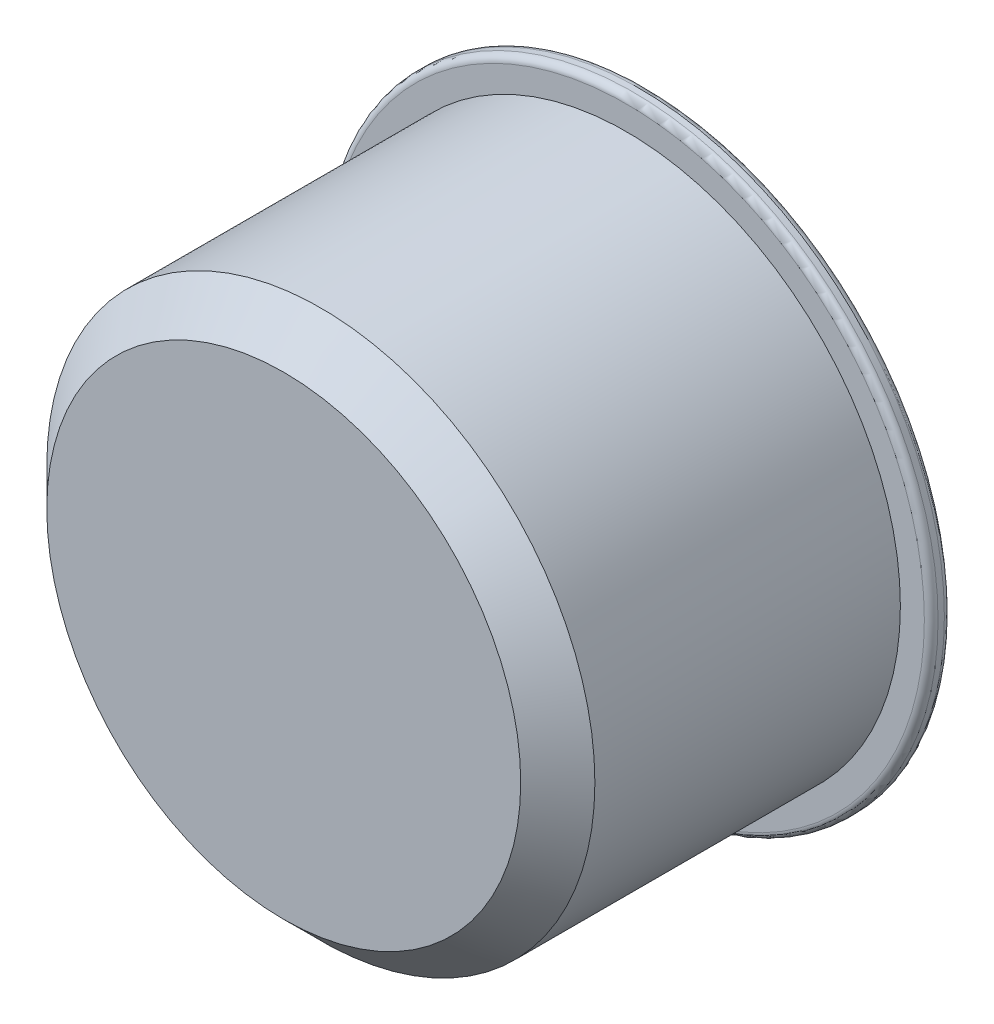
ISO-10303-21;
HEADER;
FILE_DESCRIPTION(('STEP AP214'),'2;1');
FILE_NAME('part.step','',(''),(''),'','','');
FILE_SCHEMA(('AUTOMOTIVE_DESIGN { 1 0 10303 214 1 1 1 1 }'));
ENDSEC;
DATA;
#1=APPLICATION_CONTEXT('core data for automotive mechanical design processes');
#2=APPLICATION_PROTOCOL_DEFINITION('international standard','automotive_design',2000,#1);
#3=PRODUCT_CONTEXT('',#1,'mechanical');
#4=PRODUCT('Part','Part','',(#3));
#5=PRODUCT_RELATED_PRODUCT_CATEGORY('part','',(#4));
#6=PRODUCT_DEFINITION_FORMATION('','',#4);
#7=PRODUCT_DEFINITION_CONTEXT('part definition',#1,'design');
#8=PRODUCT_DEFINITION('design','',#6,#7);
#9=PRODUCT_DEFINITION_SHAPE('','',#8);
#10=(LENGTH_UNIT() NAMED_UNIT(*) SI_UNIT(.MILLI.,.METRE.));
#11=(NAMED_UNIT(*) PLANE_ANGLE_UNIT() SI_UNIT($,.RADIAN.));
#12=(NAMED_UNIT(*) SI_UNIT($,.STERADIAN.) SOLID_ANGLE_UNIT());
#13=UNCERTAINTY_MEASURE_WITH_UNIT(LENGTH_MEASURE(1.E-05),#10,'distance_accuracy_value','');
#14=(GEOMETRIC_REPRESENTATION_CONTEXT(3) GLOBAL_UNCERTAINTY_ASSIGNED_CONTEXT((#13)) GLOBAL_UNIT_ASSIGNED_CONTEXT((#10,
#11,#12)) REPRESENTATION_CONTEXT('',''));
#15=CARTESIAN_POINT('',(0.,0.,0.));
#16=DIRECTION('',(0.,0.,1.));
#17=DIRECTION('',(1.,0.,0.));
#18=AXIS2_PLACEMENT_3D('',#15,#16,#17);
#19=CARTESIAN_POINT('',(0.,0.,1.6));
#20=DIRECTION('',(0.,0.,-1.));
#21=DIRECTION('',(-1.,0.,0.));
#22=AXIS2_PLACEMENT_3D('',#19,#20,#21);
#23=CYLINDRICAL_SURFACE('',#22,8.9);
#24=CARTESIAN_POINT('',(0.,0.,1.4));
#25=DIRECTION('',(0.,0.,1.));
#26=DIRECTION('',(1.,0.,0.));
#27=AXIS2_PLACEMENT_3D('',#24,#25,#26);
#28=CIRCLE('',#27,8.9);
#29=CARTESIAN_POINT('',(8.9,0.,1.4));
#30=VERTEX_POINT('',#29);
#31=EDGE_CURVE('E55',#30,#30,#28,.F.);
#32=ORIENTED_EDGE('',*,*,#31,.T.);
#33=EDGE_LOOP('',(#32));
#34=FACE_BOUND('',#33,.T.);
#35=CARTESIAN_POINT('',(0.,0.,1.21531050947474));
#36=DIRECTION('',(0.,0.,1.));
#37=DIRECTION('',(1.,0.,0.));
#38=AXIS2_PLACEMENT_3D('',#35,#36,#37);
#39=CIRCLE('',#38,8.9);
#40=CARTESIAN_POINT('',(8.9,0.,1.21531050947474));
#41=VERTEX_POINT('',#40);
#42=EDGE_CURVE('E351',#41,#41,#39,.T.);
#43=ORIENTED_EDGE('',*,*,#42,.T.);
#44=EDGE_LOOP('',(#43));
#45=FACE_BOUND('',#44,.T.);
#46=ADVANCED_FACE('F46',(#34,#45),#23,.T.);
#47=CARTESIAN_POINT('',(0.,0.,1.6));
#48=DIRECTION('',(0.,0.,1.));
#49=DIRECTION('',(1.,0.,0.));
#50=AXIS2_PLACEMENT_3D('',#47,#48,#49);
#51=PLANE('',#50);
#52=CARTESIAN_POINT('',(0.,0.,1.6));
#53=DIRECTION('',(0.,0.,1.));
#54=DIRECTION('',(1.,0.,0.));
#55=AXIS2_PLACEMENT_3D('',#52,#53,#54);
#56=CIRCLE('',#55,8.7);
#57=CARTESIAN_POINT('',(8.7,0.,1.6));
#58=VERTEX_POINT('',#57);
#59=EDGE_CURVE('E347',#58,#58,#56,.T.);
#60=ORIENTED_EDGE('',*,*,#59,.T.);
#61=EDGE_LOOP('',(#60));
#62=FACE_BOUND('',#61,.T.);
#63=CARTESIAN_POINT('',(0.,0.,1.6));
#64=DIRECTION('',(0.,0.,1.));
#65=DIRECTION('',(1.,0.,0.));
#66=AXIS2_PLACEMENT_3D('',#63,#64,#65);
#67=CIRCLE('',#66,8.);
#68=CARTESIAN_POINT('',(8.,0.,1.6));
#69=VERTEX_POINT('',#68);
#70=EDGE_CURVE('E324',#69,#69,#67,.T.);
#71=ORIENTED_EDGE('',*,*,#70,.F.);
#72=EDGE_LOOP('',(#71));
#73=FACE_BOUND('',#72,.T.);
#74=ADVANCED_FACE('F366',(#62,#73),#51,.T.);
#75=CARTESIAN_POINT('',(0.,0.,1.1));
#76=DIRECTION('',(0.,0.,1.));
#77=DIRECTION('',(1.,0.,0.));
#78=AXIS2_PLACEMENT_3D('',#75,#76,#77);
#79=CONICAL_SURFACE('',#78,8.9,1.04600055514479);
#80=CARTESIAN_POINT('',(0.,0.,1.04222525237851));
#81=DIRECTION('',(0.,0.,-1.));
#82=DIRECTION('',(-1.,0.,0.));
#83=AXIS2_PLACEMENT_3D('',#80,#81,#82);
#84=CIRCLE('',#83,8.80020725410834);
#85=CARTESIAN_POINT('',(-8.80020725410834,0.,1.04222525237851));
#86=VERTEX_POINT('',#85);
#87=EDGE_CURVE('E11',#86,#86,#84,.T.);
#88=ORIENTED_EDGE('',*,*,#87,.T.);
#89=EDGE_LOOP('',(#88));
#90=FACE_BOUND('',#89,.T.);
#91=CARTESIAN_POINT('',(0.,0.,0.));
#92=DIRECTION('',(0.,0.,-1.));
#93=DIRECTION('',(-1.,0.,0.));
#94=AXIS2_PLACEMENT_3D('',#91,#92,#93);
#95=CIRCLE('',#94,7.);
#96=CARTESIAN_POINT('',(-7.,0.,0.));
#97=VERTEX_POINT('',#96);
#98=EDGE_CURVE('E323',#97,#97,#95,.T.);
#99=ORIENTED_EDGE('',*,*,#98,.F.);
#100=EDGE_LOOP('',(#99));
#101=FACE_BOUND('',#100,.T.);
#102=ADVANCED_FACE('F369',(#90,#101),#79,.T.);
#103=CARTESIAN_POINT('',(0.,0.,0.));
#104=DIRECTION('',(0.,0.,1.));
#105=DIRECTION('',(1.,0.,0.));
#106=AXIS2_PLACEMENT_3D('',#103,#104,#105);
#107=PLANE('',#106);
#108=CARTESIAN_POINT('',(0.,0.,0.));
#109=DIRECTION('',(0.,0.,1.));
#110=DIRECTION('',(1.,0.,0.));
#111=AXIS2_PLACEMENT_3D('',#108,#109,#110);
#112=CIRCLE('',#111,6.6);
#113=CARTESIAN_POINT('',(6.6,0.,0.));
#114=VERTEX_POINT('',#113);
#115=EDGE_CURVE('E335',#114,#114,#112,.T.);
#116=ORIENTED_EDGE('',*,*,#115,.T.);
#117=EDGE_LOOP('',(#116));
#118=FACE_BOUND('',#117,.T.);
#119=ORIENTED_EDGE('',*,*,#98,.T.);
#120=EDGE_LOOP('',(#119));
#121=FACE_BOUND('',#120,.T.);
#122=ADVANCED_FACE('F376',(#118,#121),#107,.F.);
#123=CARTESIAN_POINT('',(0.,0.,11.6));
#124=DIRECTION('',(0.,0.,-1.));
#125=DIRECTION('',(-1.,0.,0.));
#126=AXIS2_PLACEMENT_3D('',#123,#124,#125);
#127=CYLINDRICAL_SURFACE('',#126,8.);
#128=CARTESIAN_POINT('',(0.,0.,10.5175));
#129=DIRECTION('',(0.,0.,-1.));
#130=DIRECTION('',(-1.,0.,0.));
#131=AXIS2_PLACEMENT_3D('',#128,#129,#130);
#132=CIRCLE('',#131,8.);
#133=CARTESIAN_POINT('',(-8.,0.,10.5175));
#134=VERTEX_POINT('',#133);
#135=EDGE_CURVE('E319',#134,#134,#132,.T.);
#136=ORIENTED_EDGE('',*,*,#135,.T.);
#137=EDGE_LOOP('',(#136));
#138=FACE_BOUND('',#137,.T.);
#139=ORIENTED_EDGE('',*,*,#70,.T.);
#140=EDGE_LOOP('',(#139));
#141=FACE_BOUND('',#140,.T.);
#142=ADVANCED_FACE('F373',(#138,#141),#127,.T.);
#143=CARTESIAN_POINT('',(0.,0.,11.6));
#144=DIRECTION('',(0.,0.,-1.));
#145=DIRECTION('',(-1.,0.,0.));
#146=AXIS2_PLACEMENT_3D('',#143,#144,#145);
#147=CONICAL_SURFACE('',#146,6.9175,0.785398163397454);
#148=ORIENTED_EDGE('',*,*,#135,.F.);
#149=EDGE_LOOP('',(#148));
#150=FACE_BOUND('',#149,.T.);
#151=CARTESIAN_POINT('',(0.,0.,11.6));
#152=DIRECTION('',(0.,0.,-1.));
#153=DIRECTION('',(-1.,0.,0.));
#154=AXIS2_PLACEMENT_3D('',#151,#152,#153);
#155=CIRCLE('',#154,6.9175);
#156=CARTESIAN_POINT('',(-6.9175,0.,11.6));
#157=VERTEX_POINT('',#156);
#158=EDGE_CURVE('E315',#157,#157,#155,.T.);
#159=ORIENTED_EDGE('',*,*,#158,.T.);
#160=EDGE_LOOP('',(#159));
#161=FACE_BOUND('',#160,.T.);
#162=ADVANCED_FACE('F375',(#150,#161),#147,.T.);
#163=CARTESIAN_POINT('',(0.,0.,11.6));
#164=DIRECTION('',(0.,0.,1.));
#165=DIRECTION('',(1.,0.,0.));
#166=AXIS2_PLACEMENT_3D('',#163,#164,#165);
#167=PLANE('',#166);
#168=ORIENTED_EDGE('',*,*,#158,.F.);
#169=EDGE_LOOP('',(#168));
#170=FACE_BOUND('',#169,.T.);
#171=ADVANCED_FACE('F383',(#170),#167,.T.);
#172=CARTESIAN_POINT('',(0.,0.,0.5));
#173=DIRECTION('',(0.,0.,-1.));
#174=DIRECTION('',(-1.,0.,0.));
#175=AXIS2_PLACEMENT_3D('',#172,#173,#174);
#176=CYLINDRICAL_SURFACE('',#175,6.5);
#177=CARTESIAN_POINT('',(0.,0.,0.100000000000002));
#178=DIRECTION('',(0.,0.,1.));
#179=DIRECTION('',(1.,0.,0.));
#180=AXIS2_PLACEMENT_3D('',#177,#178,#179);
#181=CIRCLE('',#180,6.5);
#182=CARTESIAN_POINT('',(6.5,0.,0.100000000000002));
#183=VERTEX_POINT('',#182);
#184=EDGE_CURVE('E328',#183,#183,#181,.F.);
#185=ORIENTED_EDGE('',*,*,#184,.T.);
#186=EDGE_LOOP('',(#185));
#187=FACE_BOUND('',#186,.T.);
#188=CARTESIAN_POINT('',(0.,0.,0.5));
#189=DIRECTION('',(0.,0.,-1.));
#190=DIRECTION('',(-1.,0.,0.));
#191=AXIS2_PLACEMENT_3D('',#188,#189,#190);
#192=CIRCLE('',#191,6.5);
#193=CARTESIAN_POINT('',(-6.5,0.,0.5));
#194=VERTEX_POINT('',#193);
#195=EDGE_CURVE('E311',#194,#194,#192,.T.);
#196=ORIENTED_EDGE('',*,*,#195,.F.);
#197=EDGE_LOOP('',(#196));
#198=FACE_BOUND('',#197,.T.);
#199=ADVANCED_FACE('F429',(#187,#198),#176,.F.);
#200=CARTESIAN_POINT('',(0.,0.,0.5));
#201=DIRECTION('',(0.,0.,-1.));
#202=DIRECTION('',(-1.,0.,0.));
#203=AXIS2_PLACEMENT_3D('',#200,#201,#202);
#204=PLANE('',#203);
#205=CARTESIAN_POINT('',(0.,0.,0.5));
#206=DIRECTION('',(0.,0.,-1.));
#207=DIRECTION('',(-1.,0.,0.));
#208=AXIS2_PLACEMENT_3D('',#205,#206,#207);
#209=CIRCLE('',#208,4.5);
#210=CARTESIAN_POINT('',(-4.5,0.,0.5));
#211=VERTEX_POINT('',#210);
#212=EDGE_CURVE('E287',#211,#211,#209,.T.);
#213=ORIENTED_EDGE('',*,*,#212,.F.);
#214=EDGE_LOOP('',(#213));
#215=FACE_BOUND('',#214,.T.);
#216=ORIENTED_EDGE('',*,*,#195,.T.);
#217=EDGE_LOOP('',(#216));
#218=FACE_BOUND('',#217,.T.);
#219=ADVANCED_FACE('F423',(#215,#218),#204,.T.);
#220=CARTESIAN_POINT('',(0.,0.,0.5));
#221=DIRECTION('',(0.,0.,-1.));
#222=DIRECTION('',(-1.,0.,0.));
#223=AXIS2_PLACEMENT_3D('',#220,#221,#222);
#224=CYLINDRICAL_SURFACE('',#223,4.5);
#225=CARTESIAN_POINT('',(0.,0.,0.0999999999999968));
#226=DIRECTION('',(0.,0.,1.));
#227=DIRECTION('',(1.,0.,0.));
#228=AXIS2_PLACEMENT_3D('',#225,#226,#227);
#229=CIRCLE('',#228,4.5);
#230=CARTESIAN_POINT('',(4.5,0.,0.0999999999999968));
#231=VERTEX_POINT('',#230);
#232=EDGE_CURVE('E343',#231,#231,#229,.T.);
#233=ORIENTED_EDGE('',*,*,#232,.T.);
#234=EDGE_LOOP('',(#233));
#235=FACE_BOUND('',#234,.T.);
#236=ORIENTED_EDGE('',*,*,#212,.T.);
#237=EDGE_LOOP('',(#236));
#238=FACE_BOUND('',#237,.T.);
#239=ADVANCED_FACE('F416',(#235,#238),#224,.T.);
#240=CARTESIAN_POINT('',(0.,0.,0.));
#241=DIRECTION('',(0.,0.,1.));
#242=DIRECTION('',(1.,0.,0.));
#243=AXIS2_PLACEMENT_3D('',#240,#241,#242);
#244=CIRCLE('',#243,4.4);
#245=CARTESIAN_POINT('',(4.4,0.,0.));
#246=VERTEX_POINT('',#245);
#247=EDGE_CURVE('E339',#246,#246,#244,.F.);
#248=ORIENTED_EDGE('',*,*,#247,.T.);
#249=EDGE_LOOP('',(#248));
#250=FACE_BOUND('',#249,.T.);
#251=DIRECTION('',(0.58453496907246,-0.811368516724342,0.));
#252=VECTOR('',#251,1.);
#253=CARTESIAN_POINT('',(-1.64343408692152,2.28118204725308,0.));
#254=LINE('',#253,#252);
#255=CARTESIAN_POINT('',(-1.70203021411499,2.36251687805403,0.));
#256=VERTEX_POINT('',#255);
#257=CARTESIAN_POINT('',(-1.64343408692152,2.28118204725308,0.));
#258=VERTEX_POINT('',#257);
#259=EDGE_CURVE('E183',#256,#258,#254,.T.);
#260=ORIENTED_EDGE('',*,*,#259,.F.);
#261=CARTESIAN_POINT('',(-1.86430391745986,2.24560988423954,0.));
#262=DIRECTION('',(0.,0.,-1.));
#263=DIRECTION('',(1.,0.,0.));
#264=AXIS2_PLACEMENT_3D('',#261,#262,#263);
#265=CIRCLE('',#264,0.200000000000002);
#266=CARTESIAN_POINT('',(-1.99205596673228,2.39949105237488,0.));
#267=VERTEX_POINT('',#266);
#268=EDGE_CURVE('E62',#267,#256,#265,.T.);
#269=ORIENTED_EDGE('',*,*,#268,.F.);
#270=CARTESIAN_POINT('',(0.,0.,0.));
#271=DIRECTION('',(0.,0.,-1.));
#272=DIRECTION('',(-1.,0.,0.));
#273=AXIS2_PLACEMENT_3D('',#270,#271,#272);
#274=CIRCLE('',#273,3.11862859042573);
#275=CARTESIAN_POINT('',(1.99205596673228,2.39949105237488,0.));
#276=VERTEX_POINT('',#275);
#277=EDGE_CURVE('E170',#276,#267,#274,.T.);
#278=ORIENTED_EDGE('',*,*,#277,.F.);
#279=CARTESIAN_POINT('',(1.86430391745985,2.24560988423954,0.));
#280=DIRECTION('',(0.,0.,-1.));
#281=DIRECTION('',(-1.,0.,0.));
#282=AXIS2_PLACEMENT_3D('',#279,#280,#281);
#283=CIRCLE('',#282,0.2);
#284=CARTESIAN_POINT('',(1.70203021411499,2.36251687805403,0.));
#285=VERTEX_POINT('',#284);
#286=EDGE_CURVE('E176',#285,#276,#283,.T.);
#287=ORIENTED_EDGE('',*,*,#286,.F.);
#288=DIRECTION('',(0.584534969072464,0.811368516724339,0.));
#289=VECTOR('',#288,1.);
#290=CARTESIAN_POINT('',(1.64343408692152,2.28118204725308,0.));
#291=LINE('',#290,#289);
#292=CARTESIAN_POINT('',(1.64343408692152,2.28118204725308,0.));
#293=VERTEX_POINT('',#292);
#294=EDGE_CURVE('E782',#293,#285,#291,.T.);
#295=ORIENTED_EDGE('',*,*,#294,.F.);
#296=CARTESIAN_POINT('',(1.80570779026639,2.16427505343859,0.));
#297=DIRECTION('',(0.,0.,-1.));
#298=DIRECTION('',(-1.,0.,0.));
#299=AXIS2_PLACEMENT_3D('',#296,#297,#298);
#300=CIRCLE('',#299,0.2);
#301=CARTESIAN_POINT('',(1.67758109798774,2.01070568564106,0.));
#302=VERTEX_POINT('',#301);
#303=EDGE_CURVE('E785',#302,#293,#300,.T.);
#304=ORIENTED_EDGE('',*,*,#303,.F.);
#305=CARTESIAN_POINT('',(0.,0.,0.));
#306=DIRECTION('',(0.,0.,1.));
#307=DIRECTION('',(-1.,0.,0.));
#308=AXIS2_PLACEMENT_3D('',#305,#306,#307);
#309=CIRCLE('',#308,2.61862859042573);
#310=CARTESIAN_POINT('',(-1.67758109798774,2.01070568564106,0.));
#311=VERTEX_POINT('',#310);
#312=EDGE_CURVE('E789',#311,#302,#309,.T.);
#313=ORIENTED_EDGE('',*,*,#312,.F.);
#314=CARTESIAN_POINT('',(-1.80570779026639,2.16427505343858,0.));
#315=DIRECTION('',(0.,0.,-1.));
#316=DIRECTION('',(1.,0.,0.));
#317=AXIS2_PLACEMENT_3D('',#314,#315,#316);
#318=CIRCLE('',#317,0.200000000000001);
#319=EDGE_CURVE('E190',#258,#311,#318,.T.);
#320=ORIENTED_EDGE('',*,*,#319,.F.);
#321=EDGE_LOOP('',(#260,#269,#278,#287,#295,#304,#313,#320));
#322=FACE_BOUND('',#321,.T.);
#323=DIRECTION('',(1.,0.,0.));
#324=VECTOR('',#323,1.);
#325=CARTESIAN_POINT('',(-0.0501220032108956,3.41494709713782,0.));
#326=LINE('',#325,#324);
#327=CARTESIAN_POINT('',(-0.0501220032108956,3.41494709713782,0.));
#328=VERTEX_POINT('',#327);
#329=CARTESIAN_POINT('',(0.0501220032108956,3.41494709713782,0.));
#330=VERTEX_POINT('',#329);
#331=EDGE_CURVE('E188',#328,#330,#326,.T.);
#332=ORIENTED_EDGE('',*,*,#331,.F.);
#333=CARTESIAN_POINT('',(-0.0501220032108956,3.21494709713782,0.));
#334=DIRECTION('',(0.,0.,-1.));
#335=DIRECTION('',(-1.,0.,0.));
#336=AXIS2_PLACEMENT_3D('',#333,#334,#335);
#337=CIRCLE('',#336,0.199999999999999);
#338=CARTESIAN_POINT('',(-0.250122003210896,3.21494709713782,0.));
#339=VERTEX_POINT('',#338);
#340=EDGE_CURVE('E70',#339,#328,#337,.T.);
#341=ORIENTED_EDGE('',*,*,#340,.F.);
#342=DIRECTION('',(0.,1.,0.));
#343=VECTOR('',#342,1.);
#344=CARTESIAN_POINT('',(-0.250122003210896,1.48079356072704,0.));
#345=LINE('',#344,#343);
#346=CARTESIAN_POINT('',(-0.250122003210896,1.48079356072704,0.));
#347=VERTEX_POINT('',#346);
#348=EDGE_CURVE('E229',#347,#339,#345,.T.);
#349=ORIENTED_EDGE('',*,*,#348,.F.);
#350=CARTESIAN_POINT('',(-0.0501220032108956,1.48079356072704,0.));
#351=DIRECTION('',(0.,0.,-1.));
#352=DIRECTION('',(-1.,0.,0.));
#353=AXIS2_PLACEMENT_3D('',#350,#351,#352);
#354=CIRCLE('',#353,0.2);
#355=CARTESIAN_POINT('',(-0.0501220032108956,1.28079356072704,0.));
#356=VERTEX_POINT('',#355);
#357=EDGE_CURVE('E277',#356,#347,#354,.T.);
#358=ORIENTED_EDGE('',*,*,#357,.F.);
#359=DIRECTION('',(-1.,0.,0.));
#360=VECTOR('',#359,1.);
#361=CARTESIAN_POINT('',(0.0501220032108956,1.28079356072704,0.));
#362=LINE('',#361,#360);
#363=CARTESIAN_POINT('',(0.0501220032108956,1.28079356072704,0.));
#364=VERTEX_POINT('',#363);
#365=EDGE_CURVE('E273',#364,#356,#362,.T.);
#366=ORIENTED_EDGE('',*,*,#365,.F.);
#367=CARTESIAN_POINT('',(0.0501220032108956,1.48079356072704,0.));
#368=DIRECTION('',(0.,0.,-1.));
#369=DIRECTION('',(-1.,0.,0.));
#370=AXIS2_PLACEMENT_3D('',#367,#368,#369);
#371=CIRCLE('',#370,0.2);
#372=CARTESIAN_POINT('',(0.250122003210896,1.48079356072704,0.));
#373=VERTEX_POINT('',#372);
#374=EDGE_CURVE('E269',#373,#364,#371,.T.);
#375=ORIENTED_EDGE('',*,*,#374,.F.);
#376=DIRECTION('',(0.,-1.,0.));
#377=VECTOR('',#376,1.);
#378=CARTESIAN_POINT('',(0.250122003210896,1.48079356072704,0.));
#379=LINE('',#378,#377);
#380=CARTESIAN_POINT('',(0.250122003210896,3.21494709713782,0.));
#381=VERTEX_POINT('',#380);
#382=EDGE_CURVE('E265',#381,#373,#379,.T.);
#383=ORIENTED_EDGE('',*,*,#382,.F.);
#384=CARTESIAN_POINT('',(0.0501220032108956,3.21494709713782,0.));
#385=DIRECTION('',(0.,0.,-1.));
#386=DIRECTION('',(1.,0.,0.));
#387=AXIS2_PLACEMENT_3D('',#384,#385,#386);
#388=CIRCLE('',#387,0.199999999999999);
#389=EDGE_CURVE('E261',#330,#381,#388,.T.);
#390=ORIENTED_EDGE('',*,*,#389,.F.);
#391=EDGE_LOOP('',(#332,#341,#349,#358,#366,#375,#383,#390));
#392=FACE_BOUND('',#391,.T.);
#393=ADVANCED_FACE('F179',(#250,#322,#392),#107,.F.);
#394=CARTESIAN_POINT('',(-0.0501220032108956,3.21494709713782,0.2));
#395=DIRECTION('',(0.,0.,-1.));
#396=DIRECTION('',(-1.,0.,0.));
#397=AXIS2_PLACEMENT_3D('',#394,#395,#396);
#398=CYLINDRICAL_SURFACE('',#397,0.199999999999999);
#399=ORIENTED_EDGE('',*,*,#340,.T.);
#400=DIRECTION('',(0.,0.,-1.));
#401=VECTOR('',#400,1.);
#402=CARTESIAN_POINT('',(-0.0501220032108956,3.41494709713782,0.2));
#403=LINE('',#402,#401);
#404=CARTESIAN_POINT('',(-0.0501220032108956,3.41494709713782,0.2));
#405=VERTEX_POINT('',#404);
#406=EDGE_CURVE('E256',#405,#328,#403,.T.);
#407=ORIENTED_EDGE('',*,*,#406,.F.);
#408=CARTESIAN_POINT('',(-0.0501220032108956,3.21494709713782,0.2));
#409=DIRECTION('',(0.,0.,-1.));
#410=DIRECTION('',(-1.,0.,0.));
#411=AXIS2_PLACEMENT_3D('',#408,#409,#410);
#412=CIRCLE('',#411,0.199999999999999);
#413=CARTESIAN_POINT('',(-0.250122003210896,3.21494709713782,0.2));
#414=VERTEX_POINT('',#413);
#415=EDGE_CURVE('E224',#414,#405,#412,.T.);
#416=ORIENTED_EDGE('',*,*,#415,.F.);
#417=DIRECTION('',(0.,0.,-1.));
#418=VECTOR('',#417,1.);
#419=CARTESIAN_POINT('',(-0.250122003210896,3.21494709713782,0.2));
#420=LINE('',#419,#418);
#421=EDGE_CURVE('E284',#414,#339,#420,.T.);
#422=ORIENTED_EDGE('',*,*,#421,.T.);
#423=EDGE_LOOP('',(#399,#407,#416,#422));
#424=FACE_BOUND('',#423,.T.);
#425=ADVANCED_FACE('F415',(#424),#398,.F.);
#426=CARTESIAN_POINT('',(-0.250122003210896,1.48079356072704,0.2));
#427=DIRECTION('',(-1.,0.,0.));
#428=DIRECTION('',(0.,0.,1.));
#429=AXIS2_PLACEMENT_3D('',#426,#427,#428);
#430=PLANE('',#429);
#431=ORIENTED_EDGE('',*,*,#348,.T.);
#432=ORIENTED_EDGE('',*,*,#421,.F.);
#433=DIRECTION('',(0.,1.,0.));
#434=VECTOR('',#433,1.);
#435=CARTESIAN_POINT('',(-0.250122003210896,1.48079356072704,0.2));
#436=LINE('',#435,#434);
#437=CARTESIAN_POINT('',(-0.250122003210896,1.48079356072704,0.2));
#438=VERTEX_POINT('',#437);
#439=EDGE_CURVE('E253',#438,#414,#436,.T.);
#440=ORIENTED_EDGE('',*,*,#439,.F.);
#441=DIRECTION('',(0.,0.,-1.));
#442=VECTOR('',#441,1.);
#443=CARTESIAN_POINT('',(-0.250122003210896,1.48079356072704,0.2));
#444=LINE('',#443,#442);
#445=EDGE_CURVE('E288',#438,#347,#444,.T.);
#446=ORIENTED_EDGE('',*,*,#445,.T.);
#447=EDGE_LOOP('',(#431,#432,#440,#446));
#448=FACE_BOUND('',#447,.T.);
#449=ADVANCED_FACE('F421',(#448),#430,.F.);
#450=CARTESIAN_POINT('',(-0.0501220032108956,1.48079356072704,0.2));
#451=DIRECTION('',(0.,0.,-1.));
#452=DIRECTION('',(-1.,0.,0.));
#453=AXIS2_PLACEMENT_3D('',#450,#451,#452);
#454=CYLINDRICAL_SURFACE('',#453,0.2);
#455=ORIENTED_EDGE('',*,*,#357,.T.);
#456=ORIENTED_EDGE('',*,*,#445,.F.);
#457=CARTESIAN_POINT('',(-0.0501220032108956,1.48079356072704,0.2));
#458=DIRECTION('',(0.,0.,-1.));
#459=DIRECTION('',(-1.,0.,0.));
#460=AXIS2_PLACEMENT_3D('',#457,#458,#459);
#461=CIRCLE('',#460,0.2);
#462=CARTESIAN_POINT('',(-0.0501220032108956,1.28079356072704,0.2));
#463=VERTEX_POINT('',#462);
#464=EDGE_CURVE('E249',#463,#438,#461,.T.);
#465=ORIENTED_EDGE('',*,*,#464,.F.);
#466=DIRECTION('',(0.,0.,-1.));
#467=VECTOR('',#466,1.);
#468=CARTESIAN_POINT('',(-0.0501220032108956,1.28079356072704,0.2));
#469=LINE('',#468,#467);
#470=EDGE_CURVE('E291',#463,#356,#469,.T.);
#471=ORIENTED_EDGE('',*,*,#470,.T.);
#472=EDGE_LOOP('',(#455,#456,#465,#471));
#473=FACE_BOUND('',#472,.T.);
#474=ADVANCED_FACE('F472',(#473),#454,.F.);
#475=CARTESIAN_POINT('',(0.0501220032108956,1.28079356072704,0.2));
#476=DIRECTION('',(0.,-1.,0.));
#477=DIRECTION('',(0.,0.,-1.));
#478=AXIS2_PLACEMENT_3D('',#475,#476,#477);
#479=PLANE('',#478);
#480=ORIENTED_EDGE('',*,*,#365,.T.);
#481=ORIENTED_EDGE('',*,*,#470,.F.);
#482=DIRECTION('',(-1.,0.,0.));
#483=VECTOR('',#482,1.);
#484=CARTESIAN_POINT('',(0.0501220032108956,1.28079356072704,0.2));
#485=LINE('',#484,#483);
#486=CARTESIAN_POINT('',(0.0501220032108956,1.28079356072704,0.2));
#487=VERTEX_POINT('',#486);
#488=EDGE_CURVE('E245',#487,#463,#485,.T.);
#489=ORIENTED_EDGE('',*,*,#488,.F.);
#490=DIRECTION('',(0.,0.,-1.));
#491=VECTOR('',#490,1.);
#492=CARTESIAN_POINT('',(0.0501220032108956,1.28079356072704,0.2));
#493=LINE('',#492,#491);
#494=EDGE_CURVE('E294',#487,#364,#493,.T.);
#495=ORIENTED_EDGE('',*,*,#494,.T.);
#496=EDGE_LOOP('',(#480,#481,#489,#495));
#497=FACE_BOUND('',#496,.T.);
#498=ADVANCED_FACE('F483',(#497),#479,.F.);
#499=CARTESIAN_POINT('',(0.0501220032108956,1.48079356072704,0.2));
#500=DIRECTION('',(0.,0.,-1.));
#501=DIRECTION('',(-1.,0.,0.));
#502=AXIS2_PLACEMENT_3D('',#499,#500,#501);
#503=CYLINDRICAL_SURFACE('',#502,0.2);
#504=ORIENTED_EDGE('',*,*,#374,.T.);
#505=ORIENTED_EDGE('',*,*,#494,.F.);
#506=CARTESIAN_POINT('',(0.0501220032108956,1.48079356072704,0.2));
#507=DIRECTION('',(0.,0.,-1.));
#508=DIRECTION('',(-1.,0.,0.));
#509=AXIS2_PLACEMENT_3D('',#506,#507,#508);
#510=CIRCLE('',#509,0.2);
#511=CARTESIAN_POINT('',(0.250122003210896,1.48079356072704,0.2));
#512=VERTEX_POINT('',#511);
#513=EDGE_CURVE('E241',#512,#487,#510,.T.);
#514=ORIENTED_EDGE('',*,*,#513,.F.);
#515=DIRECTION('',(0.,0.,-1.));
#516=VECTOR('',#515,1.);
#517=CARTESIAN_POINT('',(0.250122003210896,1.48079356072704,0.2));
#518=LINE('',#517,#516);
#519=EDGE_CURVE('E297',#512,#373,#518,.T.);
#520=ORIENTED_EDGE('',*,*,#519,.T.);
#521=EDGE_LOOP('',(#504,#505,#514,#520));
#522=FACE_BOUND('',#521,.T.);
#523=ADVANCED_FACE('F494',(#522),#503,.F.);
#524=CARTESIAN_POINT('',(0.250122003210896,1.48079356072704,0.2));
#525=DIRECTION('',(1.,0.,0.));
#526=DIRECTION('',(0.,0.,-1.));
#527=AXIS2_PLACEMENT_3D('',#524,#525,#526);
#528=PLANE('',#527);
#529=ORIENTED_EDGE('',*,*,#382,.T.);
#530=ORIENTED_EDGE('',*,*,#519,.F.);
#531=DIRECTION('',(0.,-1.,0.));
#532=VECTOR('',#531,1.);
#533=CARTESIAN_POINT('',(0.250122003210896,1.48079356072704,0.2));
#534=LINE('',#533,#532);
#535=CARTESIAN_POINT('',(0.250122003210896,3.21494709713782,0.2));
#536=VERTEX_POINT('',#535);
#537=EDGE_CURVE('E237',#536,#512,#534,.T.);
#538=ORIENTED_EDGE('',*,*,#537,.F.);
#539=DIRECTION('',(0.,0.,-1.));
#540=VECTOR('',#539,1.);
#541=CARTESIAN_POINT('',(0.250122003210896,3.21494709713782,0.2));
#542=LINE('',#541,#540);
#543=EDGE_CURVE('E300',#536,#381,#542,.T.);
#544=ORIENTED_EDGE('',*,*,#543,.T.);
#545=EDGE_LOOP('',(#529,#530,#538,#544));
#546=FACE_BOUND('',#545,.T.);
#547=ADVANCED_FACE('F505',(#546),#528,.F.);
#548=CARTESIAN_POINT('',(0.0501220032108956,3.21494709713782,0.2));
#549=DIRECTION('',(0.,0.,-1.));
#550=DIRECTION('',(-1.,0.,0.));
#551=AXIS2_PLACEMENT_3D('',#548,#549,#550);
#552=CYLINDRICAL_SURFACE('',#551,0.199999999999999);
#553=ORIENTED_EDGE('',*,*,#389,.T.);
#554=ORIENTED_EDGE('',*,*,#543,.F.);
#555=CARTESIAN_POINT('',(0.0501220032108956,3.21494709713782,0.2));
#556=DIRECTION('',(0.,0.,-1.));
#557=DIRECTION('',(1.,0.,0.));
#558=AXIS2_PLACEMENT_3D('',#555,#556,#557);
#559=CIRCLE('',#558,0.199999999999999);
#560=CARTESIAN_POINT('',(0.0501220032108956,3.41494709713782,0.2));
#561=VERTEX_POINT('',#560);
#562=EDGE_CURVE('E233',#561,#536,#559,.T.);
#563=ORIENTED_EDGE('',*,*,#562,.F.);
#564=DIRECTION('',(0.,0.,-1.));
#565=VECTOR('',#564,1.);
#566=CARTESIAN_POINT('',(0.0501220032108956,3.41494709713782,0.2));
#567=LINE('',#566,#565);
#568=EDGE_CURVE('E303',#561,#330,#567,.T.);
#569=ORIENTED_EDGE('',*,*,#568,.T.);
#570=EDGE_LOOP('',(#553,#554,#563,#569));
#571=FACE_BOUND('',#570,.T.);
#572=ADVANCED_FACE('F516',(#571),#552,.F.);
#573=CARTESIAN_POINT('',(-0.0501220032108956,3.41494709713782,0.2));
#574=DIRECTION('',(0.,1.,0.));
#575=DIRECTION('',(0.,0.,1.));
#576=AXIS2_PLACEMENT_3D('',#573,#574,#575);
#577=PLANE('',#576);
#578=ORIENTED_EDGE('',*,*,#331,.T.);
#579=ORIENTED_EDGE('',*,*,#568,.F.);
#580=DIRECTION('',(1.,0.,0.));
#581=VECTOR('',#580,1.);
#582=CARTESIAN_POINT('',(-0.0501220032108956,3.41494709713782,0.2));
#583=LINE('',#582,#581);
#584=EDGE_CURVE('E228',#405,#561,#583,.T.);
#585=ORIENTED_EDGE('',*,*,#584,.F.);
#586=ORIENTED_EDGE('',*,*,#406,.T.);
#587=EDGE_LOOP('',(#578,#579,#585,#586));
#588=FACE_BOUND('',#587,.T.);
#589=ADVANCED_FACE('F527',(#588),#577,.F.);
#590=CARTESIAN_POINT('',(-0.0501220032108956,3.21494709713782,0.2));
#591=DIRECTION('',(0.,0.,-1.));
#592=DIRECTION('',(-1.,0.,0.));
#593=AXIS2_PLACEMENT_3D('',#590,#591,#592);
#594=PLANE('',#593);
#595=ORIENTED_EDGE('',*,*,#415,.T.);
#596=ORIENTED_EDGE('',*,*,#584,.T.);
#597=ORIENTED_EDGE('',*,*,#562,.T.);
#598=ORIENTED_EDGE('',*,*,#537,.T.);
#599=ORIENTED_EDGE('',*,*,#513,.T.);
#600=ORIENTED_EDGE('',*,*,#488,.T.);
#601=ORIENTED_EDGE('',*,*,#464,.T.);
#602=ORIENTED_EDGE('',*,*,#439,.T.);
#603=EDGE_LOOP('',(#595,#596,#597,#598,#599,#600,#601,#602));
#604=FACE_BOUND('',#603,.T.);
#605=ADVANCED_FACE('F538',(#604),#594,.T.);
#606=CARTESIAN_POINT('',(-1.86430391745986,2.24560988423954,0.2));
#607=DIRECTION('',(0.,0.,-1.));
#608=DIRECTION('',(-1.,0.,0.));
#609=AXIS2_PLACEMENT_3D('',#606,#607,#608);
#610=CYLINDRICAL_SURFACE('',#609,0.200000000000002);
#611=ORIENTED_EDGE('',*,*,#268,.T.);
#612=DIRECTION('',(0.,0.,-1.));
#613=VECTOR('',#612,1.);
#614=CARTESIAN_POINT('',(-1.70203021411499,2.36251687805403,0.2));
#615=LINE('',#614,#613);
#616=CARTESIAN_POINT('',(-1.70203021411499,2.36251687805403,0.2));
#617=VERTEX_POINT('',#616);
#618=EDGE_CURVE('E198',#617,#256,#615,.T.);
#619=ORIENTED_EDGE('',*,*,#618,.F.);
#620=CARTESIAN_POINT('',(-1.86430391745986,2.24560988423954,0.2));
#621=DIRECTION('',(0.,0.,-1.));
#622=DIRECTION('',(1.,0.,0.));
#623=AXIS2_PLACEMENT_3D('',#620,#621,#622);
#624=CIRCLE('',#623,0.200000000000002);
#625=CARTESIAN_POINT('',(-1.99205596673228,2.39949105237488,0.2));
#626=VERTEX_POINT('',#625);
#627=EDGE_CURVE('E162',#626,#617,#624,.T.);
#628=ORIENTED_EDGE('',*,*,#627,.F.);
#629=DIRECTION('',(0.,0.,-1.));
#630=VECTOR('',#629,1.);
#631=CARTESIAN_POINT('',(-1.99205596673228,2.39949105237488,0.2));
#632=LINE('',#631,#630);
#633=EDGE_CURVE('E158',#626,#267,#632,.T.);
#634=ORIENTED_EDGE('',*,*,#633,.T.);
#635=EDGE_LOOP('',(#611,#619,#628,#634));
#636=FACE_BOUND('',#635,.T.);
#637=ADVANCED_FACE('F160',(#636),#610,.F.);
#638=CARTESIAN_POINT('',(0.,0.,0.2));
#639=DIRECTION('',(0.,0.,-1.));
#640=DIRECTION('',(-1.,0.,0.));
#641=AXIS2_PLACEMENT_3D('',#638,#639,#640);
#642=CYLINDRICAL_SURFACE('',#641,3.11862859042573);
#643=ORIENTED_EDGE('',*,*,#277,.T.);
#644=ORIENTED_EDGE('',*,*,#633,.F.);
#645=CARTESIAN_POINT('',(0.,0.,0.2));
#646=DIRECTION('',(0.,0.,-1.));
#647=DIRECTION('',(-1.,0.,0.));
#648=AXIS2_PLACEMENT_3D('',#645,#646,#647);
#649=CIRCLE('',#648,3.11862859042573);
#650=CARTESIAN_POINT('',(1.99205596673228,2.39949105237488,0.2));
#651=VERTEX_POINT('',#650);
#652=EDGE_CURVE('E194',#651,#626,#649,.T.);
#653=ORIENTED_EDGE('',*,*,#652,.F.);
#654=DIRECTION('',(0.,0.,-1.));
#655=VECTOR('',#654,1.);
#656=CARTESIAN_POINT('',(1.99205596673228,2.39949105237488,0.2));
#657=LINE('',#656,#655);
#658=EDGE_CURVE('E167',#651,#276,#657,.T.);
#659=ORIENTED_EDGE('',*,*,#658,.T.);
#660=EDGE_LOOP('',(#643,#644,#653,#659));
#661=FACE_BOUND('',#660,.T.);
#662=ADVANCED_FACE('F171',(#661),#642,.F.);
#663=CARTESIAN_POINT('',(1.86430391745985,2.24560988423954,0.2));
#664=DIRECTION('',(0.,0.,-1.));
#665=DIRECTION('',(-1.,0.,0.));
#666=AXIS2_PLACEMENT_3D('',#663,#664,#665);
#667=CYLINDRICAL_SURFACE('',#666,0.2);
#668=ORIENTED_EDGE('',*,*,#286,.T.);
#669=ORIENTED_EDGE('',*,*,#658,.F.);
#670=CARTESIAN_POINT('',(1.86430391745985,2.24560988423954,0.2));
#671=DIRECTION('',(0.,0.,-1.));
#672=DIRECTION('',(-1.,0.,0.));
#673=AXIS2_PLACEMENT_3D('',#670,#671,#672);
#674=CIRCLE('',#673,0.2);
#675=CARTESIAN_POINT('',(1.70203021411499,2.36251687805403,0.2));
#676=VERTEX_POINT('',#675);
#677=EDGE_CURVE('E197',#676,#651,#674,.T.);
#678=ORIENTED_EDGE('',*,*,#677,.F.);
#679=DIRECTION('',(0.,0.,-1.));
#680=VECTOR('',#679,1.);
#681=CARTESIAN_POINT('',(1.70203021411499,2.36251687805403,0.2));
#682=LINE('',#681,#680);
#683=EDGE_CURVE('E771',#676,#285,#682,.T.);
#684=ORIENTED_EDGE('',*,*,#683,.T.);
#685=EDGE_LOOP('',(#668,#669,#678,#684));
#686=FACE_BOUND('',#685,.T.);
#687=ADVANCED_FACE('F567',(#686),#667,.F.);
#688=CARTESIAN_POINT('',(1.64343408692152,2.28118204725308,0.2));
#689=DIRECTION('',(-0.811368516724339,0.584534969072464,0.));
#690=DIRECTION('',(-0.584534969072464,-0.811368516724339,0.));
#691=AXIS2_PLACEMENT_3D('',#688,#689,#690);
#692=PLANE('',#691);
#693=ORIENTED_EDGE('',*,*,#294,.T.);
#694=ORIENTED_EDGE('',*,*,#683,.F.);
#695=DIRECTION('',(0.584534969072464,0.811368516724339,0.));
#696=VECTOR('',#695,1.);
#697=CARTESIAN_POINT('',(1.64343408692152,2.28118204725308,0.2));
#698=LINE('',#697,#696);
#699=CARTESIAN_POINT('',(1.64343408692152,2.28118204725308,0.2));
#700=VERTEX_POINT('',#699);
#701=EDGE_CURVE('E202',#700,#676,#698,.T.);
#702=ORIENTED_EDGE('',*,*,#701,.F.);
#703=DIRECTION('',(0.,0.,-1.));
#704=VECTOR('',#703,1.);
#705=CARTESIAN_POINT('',(1.64343408692152,2.28118204725308,0.2));
#706=LINE('',#705,#704);
#707=EDGE_CURVE('E776',#700,#293,#706,.T.);
#708=ORIENTED_EDGE('',*,*,#707,.T.);
#709=EDGE_LOOP('',(#693,#694,#702,#708));
#710=FACE_BOUND('',#709,.T.);
#711=ADVANCED_FACE('F577',(#710),#692,.F.);
#712=CARTESIAN_POINT('',(1.80570779026639,2.16427505343859,0.2));
#713=DIRECTION('',(0.,0.,-1.));
#714=DIRECTION('',(-1.,0.,0.));
#715=AXIS2_PLACEMENT_3D('',#712,#713,#714);
#716=CYLINDRICAL_SURFACE('',#715,0.2);
#717=ORIENTED_EDGE('',*,*,#303,.T.);
#718=ORIENTED_EDGE('',*,*,#707,.F.);
#719=CARTESIAN_POINT('',(1.80570779026639,2.16427505343859,0.2));
#720=DIRECTION('',(0.,0.,-1.));
#721=DIRECTION('',(-1.,0.,0.));
#722=AXIS2_PLACEMENT_3D('',#719,#720,#721);
#723=CIRCLE('',#722,0.2);
#724=CARTESIAN_POINT('',(1.67758109798774,2.01070568564106,0.2));
#725=VERTEX_POINT('',#724);
#726=EDGE_CURVE('E206',#725,#700,#723,.T.);
#727=ORIENTED_EDGE('',*,*,#726,.F.);
#728=DIRECTION('',(0.,0.,-1.));
#729=VECTOR('',#728,1.);
#730=CARTESIAN_POINT('',(1.67758109798774,2.01070568564106,0.2));
#731=LINE('',#730,#729);
#732=EDGE_CURVE('E801',#725,#302,#731,.T.);
#733=ORIENTED_EDGE('',*,*,#732,.T.);
#734=EDGE_LOOP('',(#717,#718,#727,#733));
#735=FACE_BOUND('',#734,.T.);
#736=ADVANCED_FACE('F588',(#735),#716,.F.);
#737=CARTESIAN_POINT('',(0.,0.,0.2));
#738=DIRECTION('',(0.,0.,-1.));
#739=DIRECTION('',(-1.,0.,0.));
#740=AXIS2_PLACEMENT_3D('',#737,#738,#739);
#741=CYLINDRICAL_SURFACE('',#740,2.61862859042573);
#742=ORIENTED_EDGE('',*,*,#312,.T.);
#743=ORIENTED_EDGE('',*,*,#732,.F.);
#744=CARTESIAN_POINT('',(0.,0.,0.2));
#745=DIRECTION('',(0.,0.,1.));
#746=DIRECTION('',(-1.,0.,0.));
#747=AXIS2_PLACEMENT_3D('',#744,#745,#746);
#748=CIRCLE('',#747,2.61862859042573);
#749=CARTESIAN_POINT('',(-1.67758109798774,2.01070568564106,0.2));
#750=VERTEX_POINT('',#749);
#751=EDGE_CURVE('E210',#750,#725,#748,.T.);
#752=ORIENTED_EDGE('',*,*,#751,.F.);
#753=DIRECTION('',(0.,0.,-1.));
#754=VECTOR('',#753,1.);
#755=CARTESIAN_POINT('',(-1.67758109798774,2.01070568564106,0.2));
#756=LINE('',#755,#754);
#757=EDGE_CURVE('E796',#750,#311,#756,.T.);
#758=ORIENTED_EDGE('',*,*,#757,.T.);
#759=EDGE_LOOP('',(#742,#743,#752,#758));
#760=FACE_BOUND('',#759,.T.);
#761=ADVANCED_FACE('F599',(#760),#741,.T.);
#762=CARTESIAN_POINT('',(-1.80570779026639,2.16427505343858,0.2));
#763=DIRECTION('',(0.,0.,-1.));
#764=DIRECTION('',(-1.,0.,0.));
#765=AXIS2_PLACEMENT_3D('',#762,#763,#764);
#766=CYLINDRICAL_SURFACE('',#765,0.200000000000001);
#767=ORIENTED_EDGE('',*,*,#319,.T.);
#768=ORIENTED_EDGE('',*,*,#757,.F.);
#769=CARTESIAN_POINT('',(-1.80570779026639,2.16427505343858,0.2));
#770=DIRECTION('',(0.,0.,-1.));
#771=DIRECTION('',(1.,0.,0.));
#772=AXIS2_PLACEMENT_3D('',#769,#770,#771);
#773=CIRCLE('',#772,0.200000000000001);
#774=CARTESIAN_POINT('',(-1.64343408692152,2.28118204725308,0.2));
#775=VERTEX_POINT('',#774);
#776=EDGE_CURVE('E214',#775,#750,#773,.T.);
#777=ORIENTED_EDGE('',*,*,#776,.F.);
#778=DIRECTION('',(0.,0.,-1.));
#779=VECTOR('',#778,1.);
#780=CARTESIAN_POINT('',(-1.64343408692152,2.28118204725308,0.2));
#781=LINE('',#780,#779);
#782=EDGE_CURVE('E798',#775,#258,#781,.T.);
#783=ORIENTED_EDGE('',*,*,#782,.T.);
#784=EDGE_LOOP('',(#767,#768,#777,#783));
#785=FACE_BOUND('',#784,.T.);
#786=ADVANCED_FACE('F610',(#785),#766,.F.);
#787=CARTESIAN_POINT('',(-1.64343408692152,2.28118204725308,0.2));
#788=DIRECTION('',(0.811368516724341,0.58453496907246,0.));
#789=DIRECTION('',(-0.58453496907246,0.811368516724341,0.));
#790=AXIS2_PLACEMENT_3D('',#787,#788,#789);
#791=PLANE('',#790);
#792=ORIENTED_EDGE('',*,*,#259,.T.);
#793=ORIENTED_EDGE('',*,*,#782,.F.);
#794=DIRECTION('',(0.58453496907246,-0.811368516724342,0.));
#795=VECTOR('',#794,1.);
#796=CARTESIAN_POINT('',(-1.64343408692152,2.28118204725308,0.2));
#797=LINE('',#796,#795);
#798=EDGE_CURVE('E218',#617,#775,#797,.T.);
#799=ORIENTED_EDGE('',*,*,#798,.F.);
#800=ORIENTED_EDGE('',*,*,#618,.T.);
#801=EDGE_LOOP('',(#792,#793,#799,#800));
#802=FACE_BOUND('',#801,.T.);
#803=ADVANCED_FACE('F621',(#802),#791,.F.);
#804=CARTESIAN_POINT('',(-1.86430391745986,2.24560988423954,0.2));
#805=DIRECTION('',(0.,0.,1.));
#806=DIRECTION('',(1.,0.,0.));
#807=AXIS2_PLACEMENT_3D('',#804,#805,#806);
#808=PLANE('',#807);
#809=ORIENTED_EDGE('',*,*,#627,.T.);
#810=ORIENTED_EDGE('',*,*,#798,.T.);
#811=ORIENTED_EDGE('',*,*,#776,.T.);
#812=ORIENTED_EDGE('',*,*,#751,.T.);
#813=ORIENTED_EDGE('',*,*,#726,.T.);
#814=ORIENTED_EDGE('',*,*,#701,.T.);
#815=ORIENTED_EDGE('',*,*,#677,.T.);
#816=ORIENTED_EDGE('',*,*,#652,.T.);
#817=EDGE_LOOP('',(#809,#810,#811,#812,#813,#814,#815,#816));
#818=FACE_BOUND('',#817,.T.);
#819=ADVANCED_FACE('F402',(#818),#808,.F.);
#820=CARTESIAN_POINT('',(0.,0.,0.100000000000002));
#821=DIRECTION('',(0.,0.,-1.));
#822=DIRECTION('',(-1.,0.,0.));
#823=AXIS2_PLACEMENT_3D('',#820,#821,#822);
#824=CONICAL_SURFACE('',#823,6.5,0.785398163397461);
#825=ORIENTED_EDGE('',*,*,#115,.F.);
#826=EDGE_LOOP('',(#825));
#827=FACE_BOUND('',#826,.T.);
#828=ORIENTED_EDGE('',*,*,#184,.F.);
#829=EDGE_LOOP('',(#828));
#830=FACE_BOUND('',#829,.T.);
#831=ADVANCED_FACE('F396',(#827,#830),#824,.F.);
#832=CARTESIAN_POINT('',(0.,0.,0.));
#833=DIRECTION('',(0.,0.,1.));
#834=DIRECTION('',(1.,0.,0.));
#835=AXIS2_PLACEMENT_3D('',#832,#833,#834);
#836=CONICAL_SURFACE('',#835,4.4,0.78539816339744);
#837=CARTESIAN_POINT('',(4.5,0.,0.0999999999999968));
#838=CARTESIAN_POINT('',(4.49895833333333,0.,0.0989583333333302));
#839=CARTESIAN_POINT('',(4.49791666666667,0.,0.0979166666666636));
#840=CARTESIAN_POINT('',(4.49583333333333,0.,0.0958333333333302));
#841=CARTESIAN_POINT('',(4.49479166666667,0.,0.0947916666666635));
#842=CARTESIAN_POINT('',(4.49270833333333,0.,0.0927083333333303));
#843=CARTESIAN_POINT('',(4.49166666666667,0.,0.0916666666666638));
#844=CARTESIAN_POINT('',(4.48958333333333,0.,0.0895833333333305));
#845=CARTESIAN_POINT('',(4.48854166666667,0.,0.0885416666666638));
#846=CARTESIAN_POINT('',(4.48645833333333,0.,0.0864583333333305));
#847=CARTESIAN_POINT('',(4.48541666666667,0.,0.0854166666666639));
#848=CARTESIAN_POINT('',(4.48333333333333,0.,0.0833333333333306));
#849=CARTESIAN_POINT('',(4.48229166666667,0.,0.0822916666666639));
#850=CARTESIAN_POINT('',(4.48020833333333,0.,0.0802083333333307));
#851=CARTESIAN_POINT('',(4.47916666666667,0.,0.0791666666666642));
#852=CARTESIAN_POINT('',(4.47708333333333,0.,0.0770833333333309));
#853=CARTESIAN_POINT('',(4.47604166666667,0.,0.0760416666666642));
#854=CARTESIAN_POINT('',(4.47395833333333,0.,0.0739583333333309));
#855=CARTESIAN_POINT('',(4.47291666666667,0.,0.0729166666666643));
#856=CARTESIAN_POINT('',(4.47083333333333,0.,0.0708333333333311));
#857=CARTESIAN_POINT('',(4.46979166666667,0.,0.0697916666666644));
#858=CARTESIAN_POINT('',(4.46770833333334,0.,0.0677083333333311));
#859=CARTESIAN_POINT('',(4.46666666666667,0.,0.0666666666666644));
#860=CARTESIAN_POINT('',(4.46458333333334,0.,0.0645833333333312));
#861=CARTESIAN_POINT('',(4.46354166666667,0.,0.0635416666666647));
#862=CARTESIAN_POINT('',(4.46145833333333,0.,0.0614583333333314));
#863=CARTESIAN_POINT('',(4.46041666666667,0.,0.0604166666666648));
#864=CARTESIAN_POINT('',(4.45833333333333,0.,0.0583333333333314));
#865=CARTESIAN_POINT('',(4.45729166666667,0.,0.0572916666666648));
#866=CARTESIAN_POINT('',(4.45520833333333,0.,0.0552083333333316));
#867=CARTESIAN_POINT('',(4.45416666666667,0.,0.0541666666666649));
#868=CARTESIAN_POINT('',(4.45208333333334,0.,0.0520833333333316));
#869=CARTESIAN_POINT('',(4.45104166666667,0.,0.0510416666666649));
#870=CARTESIAN_POINT('',(4.44895833333334,0.,0.0489583333333317));
#871=CARTESIAN_POINT('',(4.44791666666667,0.,0.0479166666666652));
#872=CARTESIAN_POINT('',(4.44583333333334,0.,0.0458333333333319));
#873=CARTESIAN_POINT('',(4.44479166666667,0.,0.0447916666666652));
#874=CARTESIAN_POINT('',(4.44270833333334,0.,0.0427083333333319));
#875=CARTESIAN_POINT('',(4.44166666666667,0.,0.0416666666666653));
#876=CARTESIAN_POINT('',(4.43958333333334,0.,0.039583333333332));
#877=CARTESIAN_POINT('',(4.43854166666667,0.,0.0385416666666653));
#878=CARTESIAN_POINT('',(4.43645833333334,0.,0.0364583333333321));
#879=CARTESIAN_POINT('',(4.43541666666667,0.,0.0354166666666656));
#880=CARTESIAN_POINT('',(4.43333333333334,0.,0.0333333333333324));
#881=CARTESIAN_POINT('',(4.43229166666667,0.,0.0322916666666656));
#882=CARTESIAN_POINT('',(4.43020833333334,0.,0.0302083333333323));
#883=CARTESIAN_POINT('',(4.42916666666667,0.,0.0291666666666657));
#884=CARTESIAN_POINT('',(4.42708333333334,0.,0.0270833333333325));
#885=CARTESIAN_POINT('',(4.42604166666667,0.,0.0260416666666659));
#886=CARTESIAN_POINT('',(4.42395833333334,0.,0.0239583333333325));
#887=CARTESIAN_POINT('',(4.42291666666667,0.,0.0229166666666658));
#888=CARTESIAN_POINT('',(4.42083333333334,0.,0.0208333333333326));
#889=CARTESIAN_POINT('',(4.41979166666667,0.,0.0197916666666661));
#890=CARTESIAN_POINT('',(4.41770833333334,0.,0.0177083333333329));
#891=CARTESIAN_POINT('',(4.41666666666667,0.,0.0166666666666661));
#892=CARTESIAN_POINT('',(4.41458333333334,0.,0.0145833333333328));
#893=CARTESIAN_POINT('',(4.41354166666667,0.,0.0135416666666662));
#894=CARTESIAN_POINT('',(4.41145833333334,0.,0.0114583333333329));
#895=CARTESIAN_POINT('',(4.41041666666667,0.,0.0104166666666662));
#896=CARTESIAN_POINT('',(4.40833333333334,0.,0.00833333333333301));
#897=CARTESIAN_POINT('',(4.40729166666667,0.,0.00729166666666648));
#898=CARTESIAN_POINT('',(4.40520833333334,0.,0.00520833333333326));
#899=CARTESIAN_POINT('',(4.40416666666667,0.,0.00416666666666658));
#900=CARTESIAN_POINT('',(4.40208333333334,0.,0.00208333333333322));
#901=CARTESIAN_POINT('',(4.40104166666667,0.,0.00104166666666653));
#902=CARTESIAN_POINT('',(4.4,0.,0.));
#903=B_SPLINE_CURVE_WITH_KNOTS('',3,(#837,#838,#839,#840,#841,#842,#843,#844,#845,#846,#847,
#848,#849,#850,#851,#852,#853,#854,#855,#856,#857,#858,#859,#860,#861,#862,#863,#864,#865,#866,
#867,#868,#869,#870,#871,#872,#873,#874,#875,#876,#877,#878,#879,#880,#881,#882,#883,#884,#885,
#886,#887,#888,#889,#890,#891,#892,#893,#894,#895,#896,#897,#898,#899,#900,#901,#902),
.UNSPECIFIED.,.F.,.F.,(4,2,2,2,2,2,2,2,2,2,2,2,2,2,2,2,2,2,2,2,2,2,2,2,2,2,2,2,2,2,2,2,4),(0.,
0.00441941738241561,0.00883883476483122,0.0132582521472474,0.017677669529663,0.0220970869120787,
0.0265165042944943,0.0309359216769105,0.0353553390593261,0.0397747564417417,0.0441941738241573,
0.0486135912065729,0.0530330085889891,0.0574524259714047,0.0618718433538204,0.066291260736236,
0.0707106781186516,0.0751300955010678,0.0795495128834834,0.083968930265899,0.0883883476483146,
0.0928077650307308,0.0972271824131464,0.101646599795562,0.106066017177978,0.110485434560393,
0.114904851942809,0.119324269325225,0.123743686707641,0.128163104090056,0.132582521472473,
0.137001938854888,0.141421356237304),.UNSPECIFIED.);
#904=EDGE_CURVE('BSEAM363',#231,#246,#903,.T.);
#905=ORIENTED_EDGE('',*,*,#232,.F.);
#906=ORIENTED_EDGE('',*,*,#247,.F.);
#907=ORIENTED_EDGE('',*,*,#904,.T.);
#908=ORIENTED_EDGE('',*,*,#904,.F.);
#909=EDGE_LOOP('',(#905,#907,#906,#908));
#910=FACE_BOUND('',#909,.T.);
#911=ADVANCED_FACE('F363',(#910),#836,.T.);
#912=CARTESIAN_POINT('',(0.,0.,1.4));
#913=DIRECTION('',(0.,0.,1.));
#914=DIRECTION('',(1.,0.,0.));
#915=AXIS2_PLACEMENT_3D('',#912,#913,#914);
#916=TOROIDAL_SURFACE('',#915,8.7,0.2);
#917=ORIENTED_EDGE('',*,*,#31,.F.);
#918=EDGE_LOOP('',(#917));
#919=FACE_BOUND('',#918,.T.);
#920=ORIENTED_EDGE('',*,*,#59,.F.);
#921=EDGE_LOOP('',(#920));
#922=FACE_BOUND('',#921,.T.);
#923=ADVANCED_FACE('F360',(#919,#922),#916,.T.);
#924=CARTESIAN_POINT('',(0.,0.,1.21531050947474));
#925=DIRECTION('',(0.,0.,1.));
#926=DIRECTION('',(1.,0.,0.));
#927=AXIS2_PLACEMENT_3D('',#924,#925,#926);
#928=TOROIDAL_SURFACE('',#927,8.7,0.2);
#929=ORIENTED_EDGE('',*,*,#42,.F.);
#930=EDGE_LOOP('',(#929));
#931=FACE_BOUND('',#930,.T.);
#932=ORIENTED_EDGE('',*,*,#87,.F.);
#933=EDGE_LOOP('',(#932));
#934=FACE_BOUND('',#933,.T.);
#935=ADVANCED_FACE('F48',(#931,#934),#928,.T.);
#936=CLOSED_SHELL('',(#46,#74,#102,#122,#142,#162,#171,#199,#219,#239,#393,#425,#449,#474,#498,
#523,#547,#572,#589,#605,#637,#662,#687,#711,#736,#761,#786,#803,#819,#831,#911,#923,#935));
#937=MANIFOLD_SOLID_BREP('B2',#936);
#938=ADVANCED_BREP_SHAPE_REPRESENTATION('',(#18,#937),#14);
#939=SHAPE_DEFINITION_REPRESENTATION(#9,#938);
ENDSEC;
END-ISO-10303-21;
